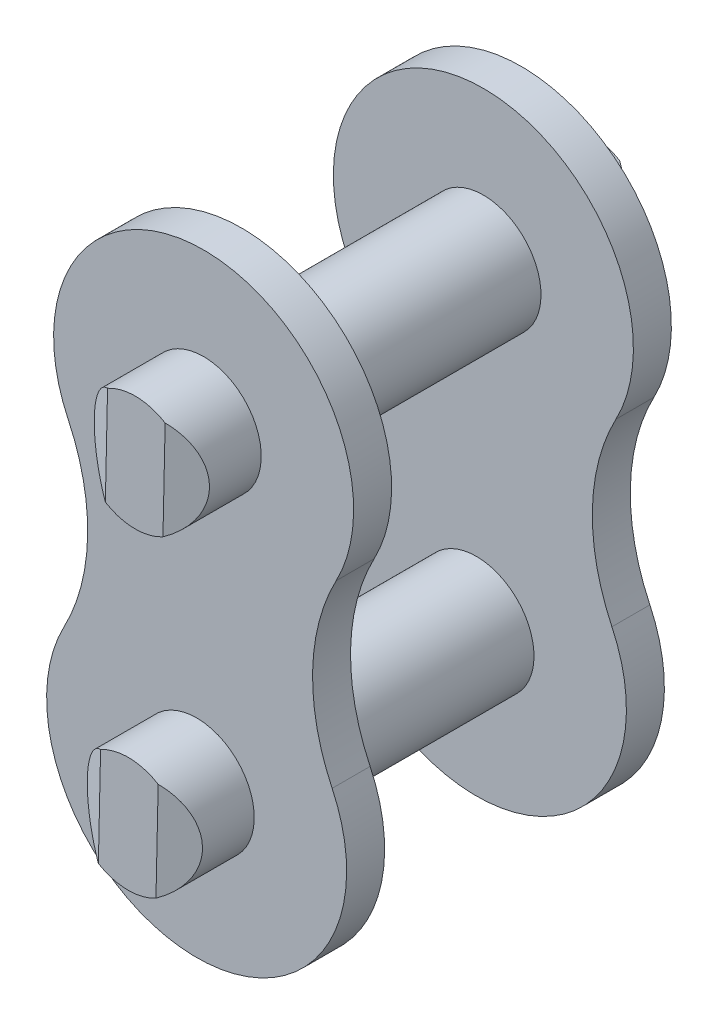
ISO-10303-21;
HEADER;
FILE_DESCRIPTION(('STEP AP214'),'2;1');
FILE_NAME('part.step','',(''),(''),'','','');
FILE_SCHEMA(('AUTOMOTIVE_DESIGN { 1 0 10303 214 1 1 1 1 }'));
ENDSEC;
DATA;
#1=APPLICATION_CONTEXT('core data for automotive mechanical design processes');
#2=APPLICATION_PROTOCOL_DEFINITION('international standard','automotive_design',2000,#1);
#3=PRODUCT_CONTEXT('',#1,'mechanical');
#4=PRODUCT('Part','Part','',(#3));
#5=PRODUCT_RELATED_PRODUCT_CATEGORY('part','',(#4));
#6=PRODUCT_DEFINITION_FORMATION('','',#4);
#7=PRODUCT_DEFINITION_CONTEXT('part definition',#1,'design');
#8=PRODUCT_DEFINITION('design','',#6,#7);
#9=PRODUCT_DEFINITION_SHAPE('','',#8);
#10=(LENGTH_UNIT() NAMED_UNIT(*) SI_UNIT(.MILLI.,.METRE.));
#11=(NAMED_UNIT(*) PLANE_ANGLE_UNIT() SI_UNIT($,.RADIAN.));
#12=(NAMED_UNIT(*) SI_UNIT($,.STERADIAN.) SOLID_ANGLE_UNIT());
#13=UNCERTAINTY_MEASURE_WITH_UNIT(LENGTH_MEASURE(1.E-05),#10,'distance_accuracy_value','');
#14=(GEOMETRIC_REPRESENTATION_CONTEXT(3) GLOBAL_UNCERTAINTY_ASSIGNED_CONTEXT((#13)) GLOBAL_UNIT_ASSIGNED_CONTEXT((#10,
#11,#12)) REPRESENTATION_CONTEXT('',''));
#15=CARTESIAN_POINT('',(0.,0.,0.));
#16=DIRECTION('',(0.,0.,1.));
#17=DIRECTION('',(1.,0.,0.));
#18=AXIS2_PLACEMENT_3D('',#15,#16,#17);
#19=CARTESIAN_POINT('',(81.604769810357,883.521423934724,-131.392489073474));
#20=DIRECTION('',(0.499878295753759,-0.0110312934108908,0.866025403784439));
#21=DIRECTION('',(-0.0220625868217816,-0.999756591507519,0.));
#22=AXIS2_PLACEMENT_3D('',#19,#20,#21);
#23=PLANE('',#22);
#24=CARTESIAN_POINT('',(82.7913000000066,898.001429416653,-131.892921853051));
#25=DIRECTION('',(-0.499878295753759,0.0110312934108908,-0.866025403784439));
#26=DIRECTION('',(-0.865814605846453,0.0191067606608627,0.5));
#27=AXIS2_PLACEMENT_3D('',#24,#25,#26);
#28=ELLIPSE('',#27,1.3344874122049,1.1557);
#29=CARTESIAN_POINT('',(82.1915089703083,897.013556342471,-131.5593));
#30=VERTEX_POINT('',#29);
#31=CARTESIAN_POINT('',(82.2356723368998,899.014800222424,-131.5593));
#32=VERTEX_POINT('',#31);
#33=EDGE_CURVE('E260',#30,#32,#28,.T.);
#34=ORIENTED_EDGE('',*,*,#33,.T.);
#35=DIRECTION('',(0.0220625868217816,0.999756591507519,0.));
#36=VECTOR('',#35,1.);
#37=CARTESIAN_POINT('',(81.8936244835583,883.515049501826,-131.5593));
#38=LINE('',#37,#36);
#39=EDGE_CURVE('E273',#30,#32,#38,.T.);
#40=ORIENTED_EDGE('',*,*,#39,.F.);
#41=EDGE_LOOP('',(#34,#40));
#42=FACE_BOUND('',#41,.T.);
#43=ADVANCED_FACE('F17',(#42),#23,.F.);
#44=CARTESIAN_POINT('',(83.3378978495648,883.483177337339,-131.392489073474));
#45=DIRECTION('',(0.49987829575376,-0.0110312934108909,-0.866025403784438));
#46=DIRECTION('',(0.,-0.999918883581333,0.0127368071925771));
#47=AXIS2_PLACEMENT_3D('',#44,#45,#46);
#48=PLANE('',#47);
#49=CARTESIAN_POINT('',(82.7913000000066,898.001429416653,-131.892921853051));
#50=DIRECTION('',(-0.49987829575376,0.0110312934108909,0.866025403784439));
#51=DIRECTION('',(0.865814605846453,-0.0191067606608627,0.5));
#52=AXIS2_PLACEMENT_3D('',#49,#50,#51);
#53=ELLIPSE('',#52,1.3344874122049,1.1557);
#54=CARTESIAN_POINT('',(83.3469276631135,896.988058610881,-131.5593));
#55=VERTEX_POINT('',#54);
#56=CARTESIAN_POINT('',(83.391091029705,898.989302490835,-131.5593));
#57=VERTEX_POINT('',#56);
#58=EDGE_CURVE('E268',#55,#57,#53,.T.);
#59=ORIENTED_EDGE('',*,*,#58,.F.);
#60=DIRECTION('',(0.0220625868217816,0.999756591507519,0.));
#61=VECTOR('',#60,1.);
#62=CARTESIAN_POINT('',(83.0490431763635,883.489551770236,-131.5593));
#63=LINE('',#62,#61);
#64=EDGE_CURVE('E228',#55,#57,#63,.T.);
#65=ORIENTED_EDGE('',*,*,#64,.T.);
#66=EDGE_LOOP('',(#59,#65));
#67=FACE_BOUND('',#66,.T.);
#68=ADVANCED_FACE('F474',(#67),#48,.T.);
#69=CARTESIAN_POINT('',(81.604769810357,883.521423934724,-131.392489073474));
#70=DIRECTION('',(0.499878295753759,-0.0110312934108908,0.866025403784439));
#71=DIRECTION('',(-0.0220625868217816,-0.999756591507519,0.));
#72=AXIS2_PLACEMENT_3D('',#69,#70,#71);
#73=PLANE('',#72);
#74=CARTESIAN_POINT('',(82.931397426325,904.349883772726,-131.892921853051));
#75=DIRECTION('',(-0.499878295753759,0.0110312934108908,-0.866025403784439));
#76=DIRECTION('',(-0.865814605846453,0.0191067606608627,0.5));
#77=AXIS2_PLACEMENT_3D('',#74,#75,#76);
#78=ELLIPSE('',#77,1.3344874122049,1.1557);
#79=CARTESIAN_POINT('',(82.3316063966266,903.362010698544,-131.5593));
#80=VERTEX_POINT('',#79);
#81=CARTESIAN_POINT('',(82.3757697632181,905.363254578497,-131.5593));
#82=VERTEX_POINT('',#81);
#83=EDGE_CURVE('E213',#80,#82,#78,.T.);
#84=ORIENTED_EDGE('',*,*,#83,.T.);
#85=DIRECTION('',(0.0220625868217816,0.999756591507519,0.));
#86=VECTOR('',#85,1.);
#87=CARTESIAN_POINT('',(81.8936244835583,883.515049501826,-131.5593));
#88=LINE('',#87,#86);
#89=EDGE_CURVE('E197',#80,#82,#88,.T.);
#90=ORIENTED_EDGE('',*,*,#89,.F.);
#91=EDGE_LOOP('',(#84,#90));
#92=FACE_BOUND('',#91,.T.);
#93=ADVANCED_FACE('F218',(#92),#73,.F.);
#94=CARTESIAN_POINT('',(83.3378978495648,883.483177337339,-131.392489073474));
#95=DIRECTION('',(0.49987829575376,-0.0110312934108909,-0.866025403784438));
#96=DIRECTION('',(0.,-0.999918883581333,0.0127368071925771));
#97=AXIS2_PLACEMENT_3D('',#94,#95,#96);
#98=PLANE('',#97);
#99=CARTESIAN_POINT('',(82.931397426325,904.349883772726,-131.892921853051));
#100=DIRECTION('',(-0.49987829575376,0.0110312934108909,0.866025403784439));
#101=DIRECTION('',(0.865814605846453,-0.0191067606608627,0.5));
#102=AXIS2_PLACEMENT_3D('',#99,#100,#101);
#103=ELLIPSE('',#102,1.3344874122049,1.1557);
#104=CARTESIAN_POINT('',(83.4870250894318,903.336512966954,-131.5593));
#105=VERTEX_POINT('',#104);
#106=CARTESIAN_POINT('',(83.5311884560233,905.337756846907,-131.5593));
#107=VERTEX_POINT('',#106);
#108=EDGE_CURVE('E215',#105,#107,#103,.T.);
#109=ORIENTED_EDGE('',*,*,#108,.F.);
#110=DIRECTION('',(0.0220625868217816,0.999756591507519,0.));
#111=VECTOR('',#110,1.);
#112=CARTESIAN_POINT('',(83.0490431763635,883.489551770236,-131.5593));
#113=LINE('',#112,#111);
#114=EDGE_CURVE('E208',#105,#107,#113,.T.);
#115=ORIENTED_EDGE('',*,*,#114,.T.);
#116=EDGE_LOOP('',(#109,#115));
#117=FACE_BOUND('',#116,.T.);
#118=ADVANCED_FACE('F510',(#117),#98,.T.);
#119=CARTESIAN_POINT('',(82.8613487131658,901.175656594689,-129.4257));
#120=DIRECTION('',(0.,0.,-1.));
#121=DIRECTION('',(0.,-1.,0.));
#122=AXIS2_PLACEMENT_3D('',#119,#120,#121);
#123=PLANE('',#122);
#124=CARTESIAN_POINT('',(82.7913000000066,898.001429416653,-129.4257));
#125=DIRECTION('',(0.,0.,1.));
#126=DIRECTION('',(0.0220625868217817,0.999756591507519,0.));
#127=AXIS2_PLACEMENT_3D('',#124,#125,#126);
#128=CIRCLE('',#127,1.1557);
#129=CARTESIAN_POINT('',(82.8167977315965,899.156848109458,-129.4257));
#130=VERTEX_POINT('',#129);
#131=EDGE_CURVE('E242',#130,#130,#128,.T.);
#132=ORIENTED_EDGE('',*,*,#131,.F.);
#133=EDGE_LOOP('',(#132));
#134=FACE_BOUND('',#133,.T.);
#135=CARTESIAN_POINT('',(82.931397426325,904.349883772726,-129.4257));
#136=DIRECTION('',(0.,0.,1.));
#137=DIRECTION('',(0.0220625868217817,0.999756591507519,0.));
#138=AXIS2_PLACEMENT_3D('',#135,#136,#137);
#139=CIRCLE('',#138,1.1557);
#140=CARTESIAN_POINT('',(82.9568951579149,905.505302465531,-129.4257));
#141=VERTEX_POINT('',#140);
#142=EDGE_CURVE('E239',#141,#141,#139,.T.);
#143=ORIENTED_EDGE('',*,*,#142,.F.);
#144=EDGE_LOOP('',(#143));
#145=FACE_BOUND('',#144,.T.);
#146=CARTESIAN_POINT('',(89.1818846027719,901.036175271926,-129.4257));
#147=DIRECTION('',(0.,0.,1.));
#148=DIRECTION('',(0.0220625868217817,0.999756591507519,0.));
#149=AXIS2_PLACEMENT_3D('',#146,#147,#148);
#150=CIRCLE('',#149,4.06464973628698);
#151=CARTESIAN_POINT('',(85.590696187897,902.940051120706,-129.4257));
#152=VERTEX_POINT('',#151);
#153=CARTESIAN_POINT('',(85.5102038614358,899.292576117189,-129.4257));
#154=VERTEX_POINT('',#153);
#155=EDGE_CURVE('E285',#152,#154,#150,.T.);
#156=ORIENTED_EDGE('',*,*,#155,.F.);
#157=CARTESIAN_POINT('',(82.9313974263249,904.349883772726,-129.4257));
#158=DIRECTION('',(0.,0.,1.));
#159=DIRECTION('',(0.0220625868217817,0.999756591507519,0.));
#160=AXIS2_PLACEMENT_3D('',#157,#158,#159);
#161=CIRCLE('',#160,3.0099);
#162=CARTESIAN_POINT('',(80.2124935648958,903.058737072189,-129.4257));
#163=VERTEX_POINT('',#162);
#164=EDGE_CURVE('E282',#152,#163,#161,.T.);
#165=ORIENTED_EDGE('',*,*,#164,.T.);
#166=CARTESIAN_POINT('',(76.5408128235598,901.315137917452,-129.4257));
#167=DIRECTION('',(0.,0.,1.));
#168=DIRECTION('',(0.0220625868217817,0.999756591507519,0.));
#169=AXIS2_PLACEMENT_3D('',#166,#167,#168);
#170=CIRCLE('',#169,4.06464973628691);
#171=CARTESIAN_POINT('',(80.1320012384346,899.411262068673,-129.4257));
#172=VERTEX_POINT('',#171);
#173=EDGE_CURVE('E301',#172,#163,#170,.T.);
#174=ORIENTED_EDGE('',*,*,#173,.F.);
#175=CARTESIAN_POINT('',(82.7913000000066,898.001429416653,-129.4257));
#176=DIRECTION('',(0.,0.,1.));
#177=DIRECTION('',(0.0220625868217817,0.999756591507519,0.));
#178=AXIS2_PLACEMENT_3D('',#175,#176,#177);
#179=CIRCLE('',#178,3.0099);
#180=EDGE_CURVE('E25',#172,#154,#179,.T.);
#181=ORIENTED_EDGE('',*,*,#180,.T.);
#182=EDGE_LOOP('',(#156,#165,#174,#181));
#183=FACE_BOUND('',#182,.T.);
#184=ADVANCED_FACE('F314',(#134,#145,#183),#123,.F.);
#185=CARTESIAN_POINT('',(82.8613487131658,901.175656594689,-130.1877));
#186=DIRECTION('',(0.,0.,-1.));
#187=DIRECTION('',(0.,-1.,0.));
#188=AXIS2_PLACEMENT_3D('',#185,#186,#187);
#189=PLANE('',#188);
#190=CARTESIAN_POINT('',(82.7913000000066,898.001429416653,-130.1877));
#191=DIRECTION('',(0.,0.,1.));
#192=DIRECTION('',(0.0220625868217817,0.999756591507519,0.));
#193=AXIS2_PLACEMENT_3D('',#190,#191,#192);
#194=CIRCLE('',#193,1.1557);
#195=CARTESIAN_POINT('',(82.8167977315965,899.156848109458,-130.1877));
#196=VERTEX_POINT('',#195);
#197=EDGE_CURVE('E257',#196,#196,#194,.T.);
#198=ORIENTED_EDGE('',*,*,#197,.T.);
#199=EDGE_LOOP('',(#198));
#200=FACE_BOUND('',#199,.T.);
#201=CARTESIAN_POINT('',(82.931397426325,904.349883772726,-130.1877));
#202=DIRECTION('',(0.,0.,1.));
#203=DIRECTION('',(0.0220625868217817,0.999756591507519,0.));
#204=AXIS2_PLACEMENT_3D('',#201,#202,#203);
#205=CIRCLE('',#204,1.1557);
#206=CARTESIAN_POINT('',(82.9568951579149,905.505302465531,-130.1877));
#207=VERTEX_POINT('',#206);
#208=EDGE_CURVE('E220',#207,#207,#205,.T.);
#209=ORIENTED_EDGE('',*,*,#208,.T.);
#210=EDGE_LOOP('',(#209));
#211=FACE_BOUND('',#210,.T.);
#212=CARTESIAN_POINT('',(89.1818846027719,901.036175271926,-130.1877));
#213=DIRECTION('',(0.,0.,1.));
#214=DIRECTION('',(0.0220625868217817,0.999756591507519,0.));
#215=AXIS2_PLACEMENT_3D('',#212,#213,#214);
#216=CIRCLE('',#215,4.06464973628698);
#217=CARTESIAN_POINT('',(85.590696187897,902.940051120706,-130.1877));
#218=VERTEX_POINT('',#217);
#219=CARTESIAN_POINT('',(85.5102038614358,899.292576117189,-130.1877));
#220=VERTEX_POINT('',#219);
#221=EDGE_CURVE('E232',#218,#220,#216,.T.);
#222=ORIENTED_EDGE('',*,*,#221,.T.);
#223=CARTESIAN_POINT('',(82.7913000000066,898.001429416653,-130.1877));
#224=DIRECTION('',(0.,0.,1.));
#225=DIRECTION('',(0.0220625868217817,0.999756591507519,0.));
#226=AXIS2_PLACEMENT_3D('',#223,#224,#225);
#227=CIRCLE('',#226,3.0099);
#228=CARTESIAN_POINT('',(80.1320012384346,899.411262068673,-130.1877));
#229=VERTEX_POINT('',#228);
#230=EDGE_CURVE('E11',#229,#220,#227,.T.);
#231=ORIENTED_EDGE('',*,*,#230,.F.);
#232=CARTESIAN_POINT('',(76.5408128235598,901.315137917452,-130.1877));
#233=DIRECTION('',(0.,0.,1.));
#234=DIRECTION('',(0.0220625868217817,0.999756591507519,0.));
#235=AXIS2_PLACEMENT_3D('',#232,#233,#234);
#236=CIRCLE('',#235,4.06464973628691);
#237=CARTESIAN_POINT('',(80.2124935648958,903.058737072189,-130.1877));
#238=VERTEX_POINT('',#237);
#239=EDGE_CURVE('E304',#229,#238,#236,.T.);
#240=ORIENTED_EDGE('',*,*,#239,.T.);
#241=CARTESIAN_POINT('',(82.9313974263249,904.349883772726,-130.1877));
#242=DIRECTION('',(0.,0.,1.));
#243=DIRECTION('',(0.0220625868217817,0.999756591507519,0.));
#244=AXIS2_PLACEMENT_3D('',#241,#242,#243);
#245=CIRCLE('',#244,3.0099);
#246=EDGE_CURVE('E293',#218,#238,#245,.T.);
#247=ORIENTED_EDGE('',*,*,#246,.F.);
#248=EDGE_LOOP('',(#222,#231,#240,#247));
#249=FACE_BOUND('',#248,.T.);
#250=ADVANCED_FACE('F329',(#200,#211,#249),#189,.T.);
#251=CARTESIAN_POINT('',(82.7913000000066,898.001429416653,-130.1877));
#252=DIRECTION('',(0.,0.,1.));
#253=DIRECTION('',(-0.0220625868217817,-0.999756591507519,0.));
#254=AXIS2_PLACEMENT_3D('',#251,#252,#253);
#255=CYLINDRICAL_SURFACE('',#254,3.0099);
#256=ORIENTED_EDGE('',*,*,#180,.F.);
#257=DIRECTION('',(0.,0.,1.));
#258=VECTOR('',#257,1.);
#259=CARTESIAN_POINT('',(80.1320012384346,899.411262068673,-130.1877));
#260=LINE('',#259,#258);
#261=EDGE_CURVE('E307',#229,#172,#260,.T.);
#262=ORIENTED_EDGE('',*,*,#261,.F.);
#263=ORIENTED_EDGE('',*,*,#230,.T.);
#264=DIRECTION('',(0.,0.,1.));
#265=VECTOR('',#264,1.);
#266=CARTESIAN_POINT('',(85.5102038614358,899.292576117189,-130.1877));
#267=LINE('',#266,#265);
#268=EDGE_CURVE('E289',#220,#154,#267,.T.);
#269=ORIENTED_EDGE('',*,*,#268,.T.);
#270=EDGE_LOOP('',(#256,#262,#263,#269));
#271=FACE_BOUND('',#270,.T.);
#272=ADVANCED_FACE('F316',(#271),#255,.T.);
#273=CARTESIAN_POINT('',(76.5408128235598,901.315137917452,-130.1877));
#274=DIRECTION('',(0.,0.,1.));
#275=DIRECTION('',(-0.0220625868217817,-0.999756591507519,0.));
#276=AXIS2_PLACEMENT_3D('',#273,#274,#275);
#277=CYLINDRICAL_SURFACE('',#276,4.06464973628691);
#278=ORIENTED_EDGE('',*,*,#173,.T.);
#279=DIRECTION('',(0.,0.,1.));
#280=VECTOR('',#279,1.);
#281=CARTESIAN_POINT('',(80.2124935648958,903.058737072189,-130.1877));
#282=LINE('',#281,#280);
#283=EDGE_CURVE('E297',#238,#163,#282,.T.);
#284=ORIENTED_EDGE('',*,*,#283,.F.);
#285=ORIENTED_EDGE('',*,*,#239,.F.);
#286=ORIENTED_EDGE('',*,*,#261,.T.);
#287=EDGE_LOOP('',(#278,#284,#285,#286));
#288=FACE_BOUND('',#287,.T.);
#289=ADVANCED_FACE('F328',(#288),#277,.F.);
#290=CARTESIAN_POINT('',(82.9313974263249,904.349883772726,-130.1877));
#291=DIRECTION('',(0.,0.,1.));
#292=DIRECTION('',(-0.0220625868217817,-0.999756591507519,0.));
#293=AXIS2_PLACEMENT_3D('',#290,#291,#292);
#294=CYLINDRICAL_SURFACE('',#293,3.0099);
#295=ORIENTED_EDGE('',*,*,#164,.F.);
#296=DIRECTION('',(0.,0.,1.));
#297=VECTOR('',#296,1.);
#298=CARTESIAN_POINT('',(85.590696187897,902.940051120706,-130.1877));
#299=LINE('',#298,#297);
#300=EDGE_CURVE('E278',#218,#152,#299,.T.);
#301=ORIENTED_EDGE('',*,*,#300,.F.);
#302=ORIENTED_EDGE('',*,*,#246,.T.);
#303=ORIENTED_EDGE('',*,*,#283,.T.);
#304=EDGE_LOOP('',(#295,#301,#302,#303));
#305=FACE_BOUND('',#304,.T.);
#306=ADVANCED_FACE('F324',(#305),#294,.T.);
#307=CARTESIAN_POINT('',(89.1818846027719,901.036175271926,-130.1877));
#308=DIRECTION('',(0.,0.,1.));
#309=DIRECTION('',(-0.0220625868217817,-0.999756591507519,0.));
#310=AXIS2_PLACEMENT_3D('',#307,#308,#309);
#311=CYLINDRICAL_SURFACE('',#310,4.06464973628698);
#312=ORIENTED_EDGE('',*,*,#155,.T.);
#313=ORIENTED_EDGE('',*,*,#268,.F.);
#314=ORIENTED_EDGE('',*,*,#221,.F.);
#315=ORIENTED_EDGE('',*,*,#300,.T.);
#316=EDGE_LOOP('',(#312,#313,#314,#315));
#317=FACE_BOUND('',#316,.T.);
#318=ADVANCED_FACE('F321',(#317),#311,.F.);
#319=CARTESIAN_POINT('',(82.8613487131658,901.175656594689,-131.5593));
#320=DIRECTION('',(0.,0.,-1.));
#321=DIRECTION('',(0.,-1.,0.));
#322=AXIS2_PLACEMENT_3D('',#319,#320,#321);
#323=PLANE('',#322);
#324=ORIENTED_EDGE('',*,*,#89,.T.);
#325=CARTESIAN_POINT('',(82.931397426325,904.349883772726,-131.5593));
#326=DIRECTION('',(0.,0.,1.));
#327=DIRECTION('',(0.0220625868217817,0.999756591507519,0.));
#328=AXIS2_PLACEMENT_3D('',#325,#326,#327);
#329=CIRCLE('',#328,1.1557);
#330=EDGE_CURVE('E200',#107,#82,#329,.T.);
#331=ORIENTED_EDGE('',*,*,#330,.F.);
#332=ORIENTED_EDGE('',*,*,#114,.F.);
#333=CARTESIAN_POINT('',(82.931397426325,904.349883772726,-131.5593));
#334=DIRECTION('',(0.,0.,1.));
#335=DIRECTION('',(0.0220625868217817,0.999756591507519,0.));
#336=AXIS2_PLACEMENT_3D('',#333,#334,#335);
#337=CIRCLE('',#336,1.1557);
#338=EDGE_CURVE('E203',#80,#105,#337,.T.);
#339=ORIENTED_EDGE('',*,*,#338,.F.);
#340=EDGE_LOOP('',(#324,#331,#332,#339));
#341=FACE_BOUND('',#340,.T.);
#342=ADVANCED_FACE('F199',(#341),#323,.T.);
#343=CARTESIAN_POINT('',(82.931397426325,904.349883772726,-131.5593));
#344=DIRECTION('',(0.,0.,1.));
#345=DIRECTION('',(-0.0220625868217817,-0.999756591507519,0.));
#346=AXIS2_PLACEMENT_3D('',#343,#344,#345);
#347=CYLINDRICAL_SURFACE('',#346,1.1557);
#348=ORIENTED_EDGE('',*,*,#83,.F.);
#349=ORIENTED_EDGE('',*,*,#338,.T.);
#350=ORIENTED_EDGE('',*,*,#108,.T.);
#351=ORIENTED_EDGE('',*,*,#330,.T.);
#352=EDGE_LOOP('',(#348,#349,#350,#351));
#353=FACE_BOUND('',#352,.T.);
#354=ORIENTED_EDGE('',*,*,#208,.F.);
#355=EDGE_LOOP('',(#354));
#356=FACE_BOUND('',#355,.T.);
#357=ADVANCED_FACE('F211',(#353,#356),#347,.T.);
#358=CARTESIAN_POINT('',(82.8613487131658,901.175656594689,-131.5593));
#359=DIRECTION('',(0.,0.,-1.));
#360=DIRECTION('',(0.,-1.,0.));
#361=AXIS2_PLACEMENT_3D('',#358,#359,#360);
#362=PLANE('',#361);
#363=ORIENTED_EDGE('',*,*,#39,.T.);
#364=CARTESIAN_POINT('',(82.7913000000066,898.001429416653,-131.5593));
#365=DIRECTION('',(0.,0.,1.));
#366=DIRECTION('',(0.0220625868217817,0.999756591507519,0.));
#367=AXIS2_PLACEMENT_3D('',#364,#365,#366);
#368=CIRCLE('',#367,1.1557);
#369=EDGE_CURVE('E272',#57,#32,#368,.T.);
#370=ORIENTED_EDGE('',*,*,#369,.F.);
#371=ORIENTED_EDGE('',*,*,#64,.F.);
#372=CARTESIAN_POINT('',(82.7913000000066,898.001429416653,-131.5593));
#373=DIRECTION('',(0.,0.,1.));
#374=DIRECTION('',(0.0220625868217817,0.999756591507519,0.));
#375=AXIS2_PLACEMENT_3D('',#372,#373,#374);
#376=CIRCLE('',#375,1.1557);
#377=EDGE_CURVE('E264',#30,#55,#376,.T.);
#378=ORIENTED_EDGE('',*,*,#377,.F.);
#379=EDGE_LOOP('',(#363,#370,#371,#378));
#380=FACE_BOUND('',#379,.T.);
#381=ADVANCED_FACE('F488',(#380),#362,.T.);
#382=CARTESIAN_POINT('',(82.7913000000066,898.001429416653,-131.5593));
#383=DIRECTION('',(0.,0.,1.));
#384=DIRECTION('',(-0.0220625868217817,-0.999756591507519,0.));
#385=AXIS2_PLACEMENT_3D('',#382,#383,#384);
#386=CYLINDRICAL_SURFACE('',#385,1.1557);
#387=ORIENTED_EDGE('',*,*,#33,.F.);
#388=ORIENTED_EDGE('',*,*,#377,.T.);
#389=ORIENTED_EDGE('',*,*,#58,.T.);
#390=ORIENTED_EDGE('',*,*,#369,.T.);
#391=EDGE_LOOP('',(#387,#388,#389,#390));
#392=FACE_BOUND('',#391,.T.);
#393=ORIENTED_EDGE('',*,*,#197,.F.);
#394=EDGE_LOOP('',(#393));
#395=FACE_BOUND('',#394,.T.);
#396=ADVANCED_FACE('F483',(#392,#395),#386,.T.);
#397=CARTESIAN_POINT('',(81.604769810357,883.521423934724,-122.607510926526));
#398=DIRECTION('',(0.499878295753759,-0.0110312934108908,-0.866025403784439));
#399=DIRECTION('',(0.,-0.999918883581333,0.012736807192577));
#400=AXIS2_PLACEMENT_3D('',#397,#398,#399);
#401=PLANE('',#400);
#402=CARTESIAN_POINT('',(82.7913000000066,898.001429416653,-122.107078146949));
#403=DIRECTION('',(0.499878295753759,-0.0110312934108908,-0.866025403784439));
#404=DIRECTION('',(-0.865814605846453,0.0191067606608627,-0.5));
#405=AXIS2_PLACEMENT_3D('',#402,#403,#404);
#406=ELLIPSE('',#405,1.3344874122049,1.1557);
#407=CARTESIAN_POINT('',(82.1915089703083,897.013556342471,-122.4407));
#408=VERTEX_POINT('',#407);
#409=CARTESIAN_POINT('',(82.2356723368998,899.014800222424,-122.4407));
#410=VERTEX_POINT('',#409);
#411=EDGE_CURVE('E427',#408,#410,#406,.T.);
#412=ORIENTED_EDGE('',*,*,#411,.F.);
#413=DIRECTION('',(0.0220625868217816,0.999756591507519,0.));
#414=VECTOR('',#413,1.);
#415=CARTESIAN_POINT('',(81.8936244835583,883.515049501826,-122.4407));
#416=LINE('',#415,#414);
#417=EDGE_CURVE('E395',#408,#410,#416,.T.);
#418=ORIENTED_EDGE('',*,*,#417,.T.);
#419=EDGE_LOOP('',(#412,#418));
#420=FACE_BOUND('',#419,.T.);
#421=ADVANCED_FACE('F468',(#420),#401,.F.);
#422=CARTESIAN_POINT('',(83.3378978495648,883.483177337339,-122.607510926526));
#423=DIRECTION('',(0.49987829575376,-0.0110312934108909,0.866025403784438));
#424=DIRECTION('',(-0.0220625868217817,-0.999756591507519,0.));
#425=AXIS2_PLACEMENT_3D('',#422,#423,#424);
#426=PLANE('',#425);
#427=CARTESIAN_POINT('',(82.7913000000066,898.001429416653,-122.107078146949));
#428=DIRECTION('',(0.49987829575376,-0.0110312934108909,0.866025403784439));
#429=DIRECTION('',(0.865814605846453,-0.0191067606608627,-0.5));
#430=AXIS2_PLACEMENT_3D('',#427,#428,#429);
#431=ELLIPSE('',#430,1.3344874122049,1.1557);
#432=CARTESIAN_POINT('',(83.3469276631135,896.988058610881,-122.4407));
#433=VERTEX_POINT('',#432);
#434=CARTESIAN_POINT('',(83.391091029705,898.989302490835,-122.4407));
#435=VERTEX_POINT('',#434);
#436=EDGE_CURVE('E406',#433,#435,#431,.T.);
#437=ORIENTED_EDGE('',*,*,#436,.T.);
#438=DIRECTION('',(0.0220625868217816,0.999756591507519,0.));
#439=VECTOR('',#438,1.);
#440=CARTESIAN_POINT('',(83.0490431763635,883.489551770236,-122.4407));
#441=LINE('',#440,#439);
#442=EDGE_CURVE('E389',#433,#435,#441,.T.);
#443=ORIENTED_EDGE('',*,*,#442,.F.);
#444=EDGE_LOOP('',(#437,#443));
#445=FACE_BOUND('',#444,.T.);
#446=ADVANCED_FACE('F458',(#445),#426,.T.);
#447=CARTESIAN_POINT('',(81.604769810357,883.521423934724,-122.607510926526));
#448=DIRECTION('',(0.499878295753759,-0.0110312934108908,-0.866025403784439));
#449=DIRECTION('',(0.,-0.999918883581333,0.012736807192577));
#450=AXIS2_PLACEMENT_3D('',#447,#448,#449);
#451=PLANE('',#450);
#452=CARTESIAN_POINT('',(82.931397426325,904.349883772726,-122.107078146949));
#453=DIRECTION('',(0.499878295753759,-0.0110312934108908,-0.866025403784439));
#454=DIRECTION('',(-0.865814605846453,0.0191067606608627,-0.5));
#455=AXIS2_PLACEMENT_3D('',#452,#453,#454);
#456=ELLIPSE('',#455,1.3344874122049,1.1557);
#457=CARTESIAN_POINT('',(82.3316063966266,903.362010698544,-122.4407));
#458=VERTEX_POINT('',#457);
#459=CARTESIAN_POINT('',(82.3757697632181,905.363254578497,-122.4407));
#460=VERTEX_POINT('',#459);
#461=EDGE_CURVE('E388',#458,#460,#456,.T.);
#462=ORIENTED_EDGE('',*,*,#461,.F.);
#463=DIRECTION('',(0.0220625868217816,0.999756591507519,0.));
#464=VECTOR('',#463,1.);
#465=CARTESIAN_POINT('',(81.8936244835583,883.515049501826,-122.4407));
#466=LINE('',#465,#464);
#467=EDGE_CURVE('E369',#458,#460,#466,.T.);
#468=ORIENTED_EDGE('',*,*,#467,.T.);
#469=EDGE_LOOP('',(#462,#468));
#470=FACE_BOUND('',#469,.T.);
#471=ADVANCED_FACE('F455',(#470),#451,.F.);
#472=CARTESIAN_POINT('',(83.3378978495648,883.483177337339,-122.607510926526));
#473=DIRECTION('',(0.49987829575376,-0.0110312934108909,0.866025403784438));
#474=DIRECTION('',(-0.0220625868217817,-0.999756591507519,0.));
#475=AXIS2_PLACEMENT_3D('',#472,#473,#474);
#476=PLANE('',#475);
#477=CARTESIAN_POINT('',(82.931397426325,904.349883772726,-122.107078146949));
#478=DIRECTION('',(0.49987829575376,-0.0110312934108909,0.866025403784439));
#479=DIRECTION('',(0.865814605846453,-0.0191067606608627,-0.5));
#480=AXIS2_PLACEMENT_3D('',#477,#478,#479);
#481=ELLIPSE('',#480,1.3344874122049,1.1557);
#482=CARTESIAN_POINT('',(83.4870250894318,903.336512966954,-122.4407));
#483=VERTEX_POINT('',#482);
#484=CARTESIAN_POINT('',(83.5311884560233,905.337756846907,-122.4407));
#485=VERTEX_POINT('',#484);
#486=EDGE_CURVE('E375',#483,#485,#481,.T.);
#487=ORIENTED_EDGE('',*,*,#486,.T.);
#488=DIRECTION('',(0.0220625868217816,0.999756591507519,0.));
#489=VECTOR('',#488,1.);
#490=CARTESIAN_POINT('',(83.0490431763635,883.489551770236,-122.4407));
#491=LINE('',#490,#489);
#492=EDGE_CURVE('E366',#483,#485,#491,.T.);
#493=ORIENTED_EDGE('',*,*,#492,.F.);
#494=EDGE_LOOP('',(#487,#493));
#495=FACE_BOUND('',#494,.T.);
#496=ADVANCED_FACE('F457',(#495),#476,.T.);
#497=CARTESIAN_POINT('',(82.7913000000066,898.001429416653,-122.4407));
#498=DIRECTION('',(0.,0.,-1.));
#499=DIRECTION('',(-0.0220625868217817,-0.999756591507519,0.));
#500=AXIS2_PLACEMENT_3D('',#497,#498,#499);
#501=CYLINDRICAL_SURFACE('',#500,1.1557);
#502=ORIENTED_EDGE('',*,*,#131,.T.);
#503=EDGE_LOOP('',(#502));
#504=FACE_BOUND('',#503,.T.);
#505=CARTESIAN_POINT('',(82.7913000000066,898.001429416653,-124.5743));
#506=DIRECTION('',(0.,0.,1.));
#507=DIRECTION('',(0.0220625868217817,0.999756591507519,0.));
#508=AXIS2_PLACEMENT_3D('',#505,#506,#507);
#509=CIRCLE('',#508,1.1557);
#510=CARTESIAN_POINT('',(82.8167977315965,899.156848109458,-124.5743));
#511=VERTEX_POINT('',#510);
#512=EDGE_CURVE('E243',#511,#511,#509,.T.);
#513=ORIENTED_EDGE('',*,*,#512,.F.);
#514=EDGE_LOOP('',(#513));
#515=FACE_BOUND('',#514,.T.);
#516=ADVANCED_FACE('F465',(#504,#515),#501,.T.);
#517=CARTESIAN_POINT('',(82.931397426325,904.349883772726,-122.4407));
#518=DIRECTION('',(0.,0.,-1.));
#519=DIRECTION('',(-0.0220625868217817,-0.999756591507519,0.));
#520=AXIS2_PLACEMENT_3D('',#517,#518,#519);
#521=CYLINDRICAL_SURFACE('',#520,1.1557);
#522=ORIENTED_EDGE('',*,*,#142,.T.);
#523=EDGE_LOOP('',(#522));
#524=FACE_BOUND('',#523,.T.);
#525=CARTESIAN_POINT('',(82.931397426325,904.349883772726,-124.5743));
#526=DIRECTION('',(0.,0.,1.));
#527=DIRECTION('',(0.0220625868217817,0.999756591507519,0.));
#528=AXIS2_PLACEMENT_3D('',#525,#526,#527);
#529=CIRCLE('',#528,1.1557);
#530=CARTESIAN_POINT('',(82.9568951579149,905.505302465531,-124.5743));
#531=VERTEX_POINT('',#530);
#532=EDGE_CURVE('E250',#531,#531,#529,.T.);
#533=ORIENTED_EDGE('',*,*,#532,.F.);
#534=EDGE_LOOP('',(#533));
#535=FACE_BOUND('',#534,.T.);
#536=ADVANCED_FACE('F640',(#524,#535),#521,.T.);
#537=CARTESIAN_POINT('',(82.8613487131658,901.175656594689,-124.5743));
#538=DIRECTION('',(0.,0.,1.));
#539=DIRECTION('',(1.,0.,0.));
#540=AXIS2_PLACEMENT_3D('',#537,#538,#539);
#541=PLANE('',#540);
#542=ORIENTED_EDGE('',*,*,#512,.T.);
#543=EDGE_LOOP('',(#542));
#544=FACE_BOUND('',#543,.T.);
#545=ORIENTED_EDGE('',*,*,#532,.T.);
#546=EDGE_LOOP('',(#545));
#547=FACE_BOUND('',#546,.T.);
#548=CARTESIAN_POINT('',(89.1818846027719,901.036175271926,-124.5743));
#549=DIRECTION('',(0.,0.,1.));
#550=DIRECTION('',(0.0220625868217817,0.999756591507519,0.));
#551=AXIS2_PLACEMENT_3D('',#548,#549,#550);
#552=CIRCLE('',#551,4.06464973628698);
#553=CARTESIAN_POINT('',(85.590696187897,902.940051120706,-124.5743));
#554=VERTEX_POINT('',#553);
#555=CARTESIAN_POINT('',(85.5102038614358,899.292576117189,-124.5743));
#556=VERTEX_POINT('',#555);
#557=EDGE_CURVE('E361',#554,#556,#552,.T.);
#558=ORIENTED_EDGE('',*,*,#557,.T.);
#559=CARTESIAN_POINT('',(82.7913000000066,898.001429416653,-124.5743));
#560=DIRECTION('',(0.,0.,1.));
#561=DIRECTION('',(0.0220625868217817,0.999756591507519,0.));
#562=AXIS2_PLACEMENT_3D('',#559,#560,#561);
#563=CIRCLE('',#562,3.0099);
#564=CARTESIAN_POINT('',(80.1320012384346,899.411262068673,-124.5743));
#565=VERTEX_POINT('',#564);
#566=EDGE_CURVE('E244',#565,#556,#563,.T.);
#567=ORIENTED_EDGE('',*,*,#566,.F.);
#568=CARTESIAN_POINT('',(76.5408128235598,901.315137917452,-124.5743));
#569=DIRECTION('',(0.,0.,1.));
#570=DIRECTION('',(0.0220625868217817,0.999756591507519,0.));
#571=AXIS2_PLACEMENT_3D('',#568,#569,#570);
#572=CIRCLE('',#571,4.06464973628691);
#573=CARTESIAN_POINT('',(80.2124935648958,903.058737072189,-124.5743));
#574=VERTEX_POINT('',#573);
#575=EDGE_CURVE('E238',#565,#574,#572,.T.);
#576=ORIENTED_EDGE('',*,*,#575,.T.);
#577=CARTESIAN_POINT('',(82.9313974263249,904.349883772726,-124.5743));
#578=DIRECTION('',(0.,0.,1.));
#579=DIRECTION('',(0.0220625868217817,0.999756591507519,0.));
#580=AXIS2_PLACEMENT_3D('',#577,#578,#579);
#581=CIRCLE('',#580,3.0099);
#582=EDGE_CURVE('E342',#554,#574,#581,.T.);
#583=ORIENTED_EDGE('',*,*,#582,.F.);
#584=EDGE_LOOP('',(#558,#567,#576,#583));
#585=FACE_BOUND('',#584,.T.);
#586=ADVANCED_FACE('F648',(#544,#547,#585),#541,.F.);
#587=CARTESIAN_POINT('',(82.8613487131658,901.175656594689,-123.8123));
#588=DIRECTION('',(0.,0.,1.));
#589=DIRECTION('',(1.,0.,0.));
#590=AXIS2_PLACEMENT_3D('',#587,#588,#589);
#591=PLANE('',#590);
#592=CARTESIAN_POINT('',(82.7913000000066,898.001429416653,-123.8123));
#593=DIRECTION('',(0.,0.,1.));
#594=DIRECTION('',(0.0220625868217817,0.999756591507519,0.));
#595=AXIS2_PLACEMENT_3D('',#592,#593,#594);
#596=CIRCLE('',#595,1.1557);
#597=CARTESIAN_POINT('',(82.8167977315965,899.156848109458,-123.8123));
#598=VERTEX_POINT('',#597);
#599=EDGE_CURVE('E436',#598,#598,#596,.T.);
#600=ORIENTED_EDGE('',*,*,#599,.F.);
#601=EDGE_LOOP('',(#600));
#602=FACE_BOUND('',#601,.T.);
#603=CARTESIAN_POINT('',(82.931397426325,904.349883772726,-123.8123));
#604=DIRECTION('',(0.,0.,1.));
#605=DIRECTION('',(0.0220625868217817,0.999756591507519,0.));
#606=AXIS2_PLACEMENT_3D('',#603,#604,#605);
#607=CIRCLE('',#606,1.1557);
#608=CARTESIAN_POINT('',(82.9568951579149,905.505302465531,-123.8123));
#609=VERTEX_POINT('',#608);
#610=EDGE_CURVE('E385',#609,#609,#607,.T.);
#611=ORIENTED_EDGE('',*,*,#610,.F.);
#612=EDGE_LOOP('',(#611));
#613=FACE_BOUND('',#612,.T.);
#614=CARTESIAN_POINT('',(89.1818846027719,901.036175271926,-123.8123));
#615=DIRECTION('',(0.,0.,1.));
#616=DIRECTION('',(0.0220625868217817,0.999756591507519,0.));
#617=AXIS2_PLACEMENT_3D('',#614,#615,#616);
#618=CIRCLE('',#617,4.06464973628698);
#619=CARTESIAN_POINT('',(85.590696187897,902.940051120706,-123.8123));
#620=VERTEX_POINT('',#619);
#621=CARTESIAN_POINT('',(85.5102038614358,899.292576117189,-123.8123));
#622=VERTEX_POINT('',#621);
#623=EDGE_CURVE('E351',#620,#622,#618,.T.);
#624=ORIENTED_EDGE('',*,*,#623,.F.);
#625=CARTESIAN_POINT('',(82.9313974263249,904.349883772726,-123.8123));
#626=DIRECTION('',(0.,0.,1.));
#627=DIRECTION('',(0.0220625868217817,0.999756591507519,0.));
#628=AXIS2_PLACEMENT_3D('',#625,#626,#627);
#629=CIRCLE('',#628,3.0099);
#630=CARTESIAN_POINT('',(80.2124935648958,903.058737072189,-123.8123));
#631=VERTEX_POINT('',#630);
#632=EDGE_CURVE('E336',#620,#631,#629,.T.);
#633=ORIENTED_EDGE('',*,*,#632,.T.);
#634=CARTESIAN_POINT('',(76.5408128235598,901.315137917452,-123.8123));
#635=DIRECTION('',(0.,0.,1.));
#636=DIRECTION('',(0.0220625868217817,0.999756591507519,0.));
#637=AXIS2_PLACEMENT_3D('',#634,#635,#636);
#638=CIRCLE('',#637,4.06464973628691);
#639=CARTESIAN_POINT('',(80.1320012384346,899.411262068673,-123.8123));
#640=VERTEX_POINT('',#639);
#641=EDGE_CURVE('E237',#640,#631,#638,.T.);
#642=ORIENTED_EDGE('',*,*,#641,.F.);
#643=CARTESIAN_POINT('',(82.7913000000066,898.001429416653,-123.8123));
#644=DIRECTION('',(0.,0.,1.));
#645=DIRECTION('',(0.0220625868217817,0.999756591507519,0.));
#646=AXIS2_PLACEMENT_3D('',#643,#644,#645);
#647=CIRCLE('',#646,3.0099);
#648=EDGE_CURVE('E247',#640,#622,#647,.T.);
#649=ORIENTED_EDGE('',*,*,#648,.T.);
#650=EDGE_LOOP('',(#624,#633,#642,#649));
#651=FACE_BOUND('',#650,.T.);
#652=ADVANCED_FACE('F659',(#602,#613,#651),#591,.T.);
#653=CARTESIAN_POINT('',(82.7913000000066,898.001429416653,-123.8123));
#654=DIRECTION('',(0.,0.,-1.));
#655=DIRECTION('',(-0.0220625868217817,-0.999756591507519,0.));
#656=AXIS2_PLACEMENT_3D('',#653,#654,#655);
#657=CYLINDRICAL_SURFACE('',#656,3.0099);
#658=ORIENTED_EDGE('',*,*,#566,.T.);
#659=DIRECTION('',(0.,0.,-1.));
#660=VECTOR('',#659,1.);
#661=CARTESIAN_POINT('',(85.5102038614358,899.292576117189,-123.8123));
#662=LINE('',#661,#660);
#663=EDGE_CURVE('E346',#622,#556,#662,.T.);
#664=ORIENTED_EDGE('',*,*,#663,.F.);
#665=ORIENTED_EDGE('',*,*,#648,.F.);
#666=DIRECTION('',(0.,0.,-1.));
#667=VECTOR('',#666,1.);
#668=CARTESIAN_POINT('',(80.1320012384346,899.411262068673,-123.8123));
#669=LINE('',#668,#667);
#670=EDGE_CURVE('E234',#640,#565,#669,.T.);
#671=ORIENTED_EDGE('',*,*,#670,.T.);
#672=EDGE_LOOP('',(#658,#664,#665,#671));
#673=FACE_BOUND('',#672,.T.);
#674=ADVANCED_FACE('F670',(#673),#657,.T.);
#675=CARTESIAN_POINT('',(76.5408128235598,901.315137917452,-123.8123));
#676=DIRECTION('',(0.,0.,-1.));
#677=DIRECTION('',(-0.0220625868217817,-0.999756591507519,0.));
#678=AXIS2_PLACEMENT_3D('',#675,#676,#677);
#679=CYLINDRICAL_SURFACE('',#678,4.06464973628691);
#680=ORIENTED_EDGE('',*,*,#575,.F.);
#681=ORIENTED_EDGE('',*,*,#670,.F.);
#682=ORIENTED_EDGE('',*,*,#641,.T.);
#683=DIRECTION('',(0.,0.,-1.));
#684=VECTOR('',#683,1.);
#685=CARTESIAN_POINT('',(80.2124935648958,903.058737072189,-123.8123));
#686=LINE('',#685,#684);
#687=EDGE_CURVE('E340',#631,#574,#686,.T.);
#688=ORIENTED_EDGE('',*,*,#687,.T.);
#689=EDGE_LOOP('',(#680,#681,#682,#688));
#690=FACE_BOUND('',#689,.T.);
#691=ADVANCED_FACE('F681',(#690),#679,.F.);
#692=CARTESIAN_POINT('',(82.9313974263249,904.349883772726,-123.8123));
#693=DIRECTION('',(0.,0.,-1.));
#694=DIRECTION('',(-0.0220625868217817,-0.999756591507519,0.));
#695=AXIS2_PLACEMENT_3D('',#692,#693,#694);
#696=CYLINDRICAL_SURFACE('',#695,3.0099);
#697=ORIENTED_EDGE('',*,*,#582,.T.);
#698=ORIENTED_EDGE('',*,*,#687,.F.);
#699=ORIENTED_EDGE('',*,*,#632,.F.);
#700=DIRECTION('',(0.,0.,-1.));
#701=VECTOR('',#700,1.);
#702=CARTESIAN_POINT('',(85.590696187897,902.940051120706,-123.8123));
#703=LINE('',#702,#701);
#704=EDGE_CURVE('E356',#620,#554,#703,.T.);
#705=ORIENTED_EDGE('',*,*,#704,.T.);
#706=EDGE_LOOP('',(#697,#698,#699,#705));
#707=FACE_BOUND('',#706,.T.);
#708=ADVANCED_FACE('F692',(#707),#696,.T.);
#709=CARTESIAN_POINT('',(89.1818846027719,901.036175271926,-123.8123));
#710=DIRECTION('',(0.,0.,-1.));
#711=DIRECTION('',(-0.0220625868217817,-0.999756591507519,0.));
#712=AXIS2_PLACEMENT_3D('',#709,#710,#711);
#713=CYLINDRICAL_SURFACE('',#712,4.06464973628698);
#714=ORIENTED_EDGE('',*,*,#557,.F.);
#715=ORIENTED_EDGE('',*,*,#704,.F.);
#716=ORIENTED_EDGE('',*,*,#623,.T.);
#717=ORIENTED_EDGE('',*,*,#663,.T.);
#718=EDGE_LOOP('',(#714,#715,#716,#717));
#719=FACE_BOUND('',#718,.T.);
#720=ADVANCED_FACE('F703',(#719),#713,.F.);
#721=CARTESIAN_POINT('',(82.8613487131658,901.175656594689,-122.4407));
#722=DIRECTION('',(0.,0.,1.));
#723=DIRECTION('',(1.,0.,0.));
#724=AXIS2_PLACEMENT_3D('',#721,#722,#723);
#725=PLANE('',#724);
#726=ORIENTED_EDGE('',*,*,#467,.F.);
#727=CARTESIAN_POINT('',(82.931397426325,904.349883772726,-122.4407));
#728=DIRECTION('',(0.,0.,1.));
#729=DIRECTION('',(0.0220625868217817,0.999756591507519,0.));
#730=AXIS2_PLACEMENT_3D('',#727,#728,#729);
#731=CIRCLE('',#730,1.1557);
#732=EDGE_CURVE('E373',#458,#483,#731,.T.);
#733=ORIENTED_EDGE('',*,*,#732,.T.);
#734=ORIENTED_EDGE('',*,*,#492,.T.);
#735=CARTESIAN_POINT('',(82.931397426325,904.349883772726,-122.4407));
#736=DIRECTION('',(0.,0.,1.));
#737=DIRECTION('',(0.0220625868217817,0.999756591507519,0.));
#738=AXIS2_PLACEMENT_3D('',#735,#736,#737);
#739=CIRCLE('',#738,1.1557);
#740=EDGE_CURVE('E379',#485,#460,#739,.T.);
#741=ORIENTED_EDGE('',*,*,#740,.T.);
#742=EDGE_LOOP('',(#726,#733,#734,#741));
#743=FACE_BOUND('',#742,.T.);
#744=ADVANCED_FACE('F447',(#743),#725,.T.);
#745=CARTESIAN_POINT('',(82.931397426325,904.349883772726,-122.4407));
#746=DIRECTION('',(0.,0.,-1.));
#747=DIRECTION('',(-0.0220625868217817,-0.999756591507519,0.));
#748=AXIS2_PLACEMENT_3D('',#745,#746,#747);
#749=CYLINDRICAL_SURFACE('',#748,1.1557);
#750=ORIENTED_EDGE('',*,*,#461,.T.);
#751=ORIENTED_EDGE('',*,*,#740,.F.);
#752=ORIENTED_EDGE('',*,*,#486,.F.);
#753=ORIENTED_EDGE('',*,*,#732,.F.);
#754=EDGE_LOOP('',(#750,#751,#752,#753));
#755=FACE_BOUND('',#754,.T.);
#756=ORIENTED_EDGE('',*,*,#610,.T.);
#757=EDGE_LOOP('',(#756));
#758=FACE_BOUND('',#757,.T.);
#759=ADVANCED_FACE('F452',(#755,#758),#749,.T.);
#760=CARTESIAN_POINT('',(82.8613487131658,901.175656594689,-122.4407));
#761=DIRECTION('',(0.,0.,1.));
#762=DIRECTION('',(1.,0.,0.));
#763=AXIS2_PLACEMENT_3D('',#760,#761,#762);
#764=PLANE('',#763);
#765=ORIENTED_EDGE('',*,*,#417,.F.);
#766=CARTESIAN_POINT('',(82.7913000000066,898.001429416653,-122.4407));
#767=DIRECTION('',(0.,0.,1.));
#768=DIRECTION('',(0.0220625868217817,0.999756591507519,0.));
#769=AXIS2_PLACEMENT_3D('',#766,#767,#768);
#770=CIRCLE('',#769,1.1557);
#771=EDGE_CURVE('E398',#408,#433,#770,.T.);
#772=ORIENTED_EDGE('',*,*,#771,.T.);
#773=ORIENTED_EDGE('',*,*,#442,.T.);
#774=CARTESIAN_POINT('',(82.7913000000066,898.001429416653,-122.4407));
#775=DIRECTION('',(0.,0.,1.));
#776=DIRECTION('',(0.0220625868217817,0.999756591507519,0.));
#777=AXIS2_PLACEMENT_3D('',#774,#775,#776);
#778=CIRCLE('',#777,1.1557);
#779=EDGE_CURVE('E411',#435,#410,#778,.T.);
#780=ORIENTED_EDGE('',*,*,#779,.T.);
#781=EDGE_LOOP('',(#765,#772,#773,#780));
#782=FACE_BOUND('',#781,.T.);
#783=ADVANCED_FACE('F732',(#782),#764,.T.);
#784=CARTESIAN_POINT('',(82.7913000000066,898.001429416653,-122.4407));
#785=DIRECTION('',(0.,0.,-1.));
#786=DIRECTION('',(-0.0220625868217817,-0.999756591507519,0.));
#787=AXIS2_PLACEMENT_3D('',#784,#785,#786);
#788=CYLINDRICAL_SURFACE('',#787,1.1557);
#789=ORIENTED_EDGE('',*,*,#411,.T.);
#790=ORIENTED_EDGE('',*,*,#779,.F.);
#791=ORIENTED_EDGE('',*,*,#436,.F.);
#792=ORIENTED_EDGE('',*,*,#771,.F.);
#793=EDGE_LOOP('',(#789,#790,#791,#792));
#794=FACE_BOUND('',#793,.T.);
#795=ORIENTED_EDGE('',*,*,#599,.T.);
#796=EDGE_LOOP('',(#795));
#797=FACE_BOUND('',#796,.T.);
#798=ADVANCED_FACE('F740',(#794,#797),#788,.T.);
#799=CLOSED_SHELL('',(#43,#68,#93,#118,#184,#250,#272,#289,#306,#318,#342,#357,#381,#396,#421,
#446,#471,#496,#516,#536,#586,#652,#674,#691,#708,#720,#744,#759,#783,#798));
#800=MANIFOLD_SOLID_BREP('B1',#799);
#801=ADVANCED_BREP_SHAPE_REPRESENTATION('',(#18,#800),#14);
#802=SHAPE_DEFINITION_REPRESENTATION(#9,#801);
ENDSEC;
END-ISO-10303-21;
